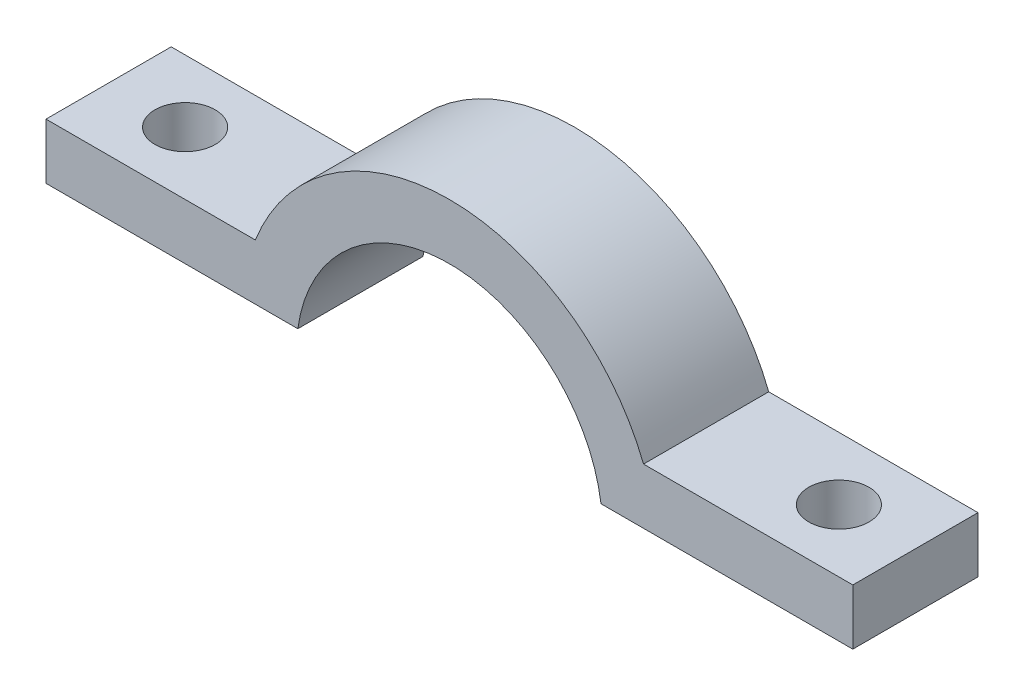
ISO-10303-21;
HEADER;
FILE_DESCRIPTION(('STEP AP214'),'2;1');
FILE_NAME('part.step','',(''),(''),'','','');
FILE_SCHEMA(('AUTOMOTIVE_DESIGN { 1 0 10303 214 1 1 1 1 }'));
ENDSEC;
DATA;
#1=APPLICATION_CONTEXT('core data for automotive mechanical design processes');
#2=APPLICATION_PROTOCOL_DEFINITION('international standard','automotive_design',2000,#1);
#3=PRODUCT_CONTEXT('',#1,'mechanical');
#4=PRODUCT('Part','Part','',(#3));
#5=PRODUCT_RELATED_PRODUCT_CATEGORY('part','',(#4));
#6=PRODUCT_DEFINITION_FORMATION('','',#4);
#7=PRODUCT_DEFINITION_CONTEXT('part definition',#1,'design');
#8=PRODUCT_DEFINITION('design','',#6,#7);
#9=PRODUCT_DEFINITION_SHAPE('','',#8);
#10=(LENGTH_UNIT() NAMED_UNIT(*) SI_UNIT(.MILLI.,.METRE.));
#11=(NAMED_UNIT(*) PLANE_ANGLE_UNIT() SI_UNIT($,.RADIAN.));
#12=(NAMED_UNIT(*) SI_UNIT($,.STERADIAN.) SOLID_ANGLE_UNIT());
#13=UNCERTAINTY_MEASURE_WITH_UNIT(LENGTH_MEASURE(1.E-05),#10,'distance_accuracy_value','');
#14=(GEOMETRIC_REPRESENTATION_CONTEXT(3) GLOBAL_UNCERTAINTY_ASSIGNED_CONTEXT((#13)) GLOBAL_UNIT_ASSIGNED_CONTEXT((#10,
#11,#12)) REPRESENTATION_CONTEXT('',''));
#15=CARTESIAN_POINT('',(0.,0.,0.));
#16=DIRECTION('',(0.,0.,1.));
#17=DIRECTION('',(1.,0.,0.));
#18=AXIS2_PLACEMENT_3D('',#15,#16,#17);
#19=CARTESIAN_POINT('',(-29.,-13.075,9.));
#20=DIRECTION('',(0.,1.,0.));
#21=DIRECTION('',(0.,0.,1.));
#22=AXIS2_PLACEMENT_3D('',#19,#20,#21);
#23=PLANE('',#22);
#24=CARTESIAN_POINT('',(-23.50000005,-13.075,4.5));
#25=DIRECTION('',(0.,1.,0.));
#26=DIRECTION('',(-1.,0.,0.));
#27=AXIS2_PLACEMENT_3D('',#24,#25,#26);
#28=CIRCLE('',#27,2.165);
#29=CARTESIAN_POINT('',(-25.66500005,-13.075,4.5));
#30=VERTEX_POINT('',#29);
#31=EDGE_CURVE('E145',#30,#30,#28,.T.);
#32=ORIENTED_EDGE('',*,*,#31,.T.);
#33=EDGE_LOOP('',(#32));
#34=FACE_BOUND('',#33,.T.);
#35=DIRECTION('',(1.,0.,0.));
#36=VECTOR('',#35,1.);
#37=CARTESIAN_POINT('',(-29.,-13.075,0.));
#38=LINE('',#37,#36);
#39=CARTESIAN_POINT('',(-29.,-13.075,0.));
#40=VERTEX_POINT('',#39);
#41=CARTESIAN_POINT('',(-10.8972473588517,-13.075,0.));
#42=VERTEX_POINT('',#41);
#43=EDGE_CURVE('E140',#40,#42,#38,.T.);
#44=ORIENTED_EDGE('',*,*,#43,.T.);
#45=DIRECTION('',(0.,0.,-1.));
#46=VECTOR('',#45,1.);
#47=CARTESIAN_POINT('',(-10.8972473588517,-13.075,9.));
#48=LINE('',#47,#46);
#49=CARTESIAN_POINT('',(-10.8972473588517,-13.075,9.));
#50=VERTEX_POINT('',#49);
#51=EDGE_CURVE('E11',#50,#42,#48,.T.);
#52=ORIENTED_EDGE('',*,*,#51,.F.);
#53=DIRECTION('',(1.,0.,0.));
#54=VECTOR('',#53,1.);
#55=CARTESIAN_POINT('',(-29.,-13.075,9.));
#56=LINE('',#55,#54);
#57=CARTESIAN_POINT('',(-29.,-13.075,9.));
#58=VERTEX_POINT('',#57);
#59=EDGE_CURVE('E163',#58,#50,#56,.T.);
#60=ORIENTED_EDGE('',*,*,#59,.F.);
#61=DIRECTION('',(0.,0.,-1.));
#62=VECTOR('',#61,1.);
#63=CARTESIAN_POINT('',(-29.,-13.075,9.));
#64=LINE('',#63,#62);
#65=EDGE_CURVE('E136',#58,#40,#64,.T.);
#66=ORIENTED_EDGE('',*,*,#65,.T.);
#67=EDGE_LOOP('',(#44,#52,#60,#66));
#68=FACE_BOUND('',#67,.T.);
#69=ADVANCED_FACE('F39',(#34,#68),#23,.F.);
#70=CARTESIAN_POINT('',(0.,-14.575,9.));
#71=DIRECTION('',(0.,0.,-1.));
#72=DIRECTION('',(-1.,0.,0.));
#73=AXIS2_PLACEMENT_3D('',#70,#71,#72);
#74=CYLINDRICAL_SURFACE('',#73,11.);
#75=CARTESIAN_POINT('',(0.,-14.575,0.));
#76=DIRECTION('',(0.,0.,-1.));
#77=DIRECTION('',(1.,0.,0.));
#78=AXIS2_PLACEMENT_3D('',#75,#76,#77);
#79=CIRCLE('',#78,11.);
#80=CARTESIAN_POINT('',(10.8972473588517,-13.075,0.));
#81=VERTEX_POINT('',#80);
#82=EDGE_CURVE('E144',#42,#81,#79,.T.);
#83=ORIENTED_EDGE('',*,*,#82,.T.);
#84=DIRECTION('',(0.,0.,-1.));
#85=VECTOR('',#84,1.);
#86=CARTESIAN_POINT('',(10.8972473588517,-13.075,9.));
#87=LINE('',#86,#85);
#88=CARTESIAN_POINT('',(10.8972473588517,-13.075,9.));
#89=VERTEX_POINT('',#88);
#90=EDGE_CURVE('E48',#89,#81,#87,.T.);
#91=ORIENTED_EDGE('',*,*,#90,.F.);
#92=CARTESIAN_POINT('',(0.,-14.575,9.));
#93=DIRECTION('',(0.,0.,-1.));
#94=DIRECTION('',(1.,0.,0.));
#95=AXIS2_PLACEMENT_3D('',#92,#93,#94);
#96=CIRCLE('',#95,11.);
#97=EDGE_CURVE('E99',#50,#89,#96,.T.);
#98=ORIENTED_EDGE('',*,*,#97,.F.);
#99=ORIENTED_EDGE('',*,*,#51,.T.);
#100=EDGE_LOOP('',(#83,#91,#98,#99));
#101=FACE_BOUND('',#100,.T.);
#102=ADVANCED_FACE('F242',(#101),#74,.F.);
#103=CARTESIAN_POINT('',(29.,-13.075,9.));
#104=DIRECTION('',(0.,1.,0.));
#105=DIRECTION('',(0.,0.,1.));
#106=AXIS2_PLACEMENT_3D('',#103,#104,#105);
#107=PLANE('',#106);
#108=CARTESIAN_POINT('',(23.50000005,-13.075,4.5));
#109=DIRECTION('',(0.,1.,0.));
#110=DIRECTION('',(-1.,0.,0.));
#111=AXIS2_PLACEMENT_3D('',#108,#109,#110);
#112=CIRCLE('',#111,2.165);
#113=CARTESIAN_POINT('',(21.33500005,-13.075,4.5));
#114=VERTEX_POINT('',#113);
#115=EDGE_CURVE('E211',#114,#114,#112,.T.);
#116=ORIENTED_EDGE('',*,*,#115,.T.);
#117=EDGE_LOOP('',(#116));
#118=FACE_BOUND('',#117,.T.);
#119=DIRECTION('',(1.,0.,0.));
#120=VECTOR('',#119,1.);
#121=CARTESIAN_POINT('',(29.,-13.075,0.));
#122=LINE('',#121,#120);
#123=CARTESIAN_POINT('',(29.,-13.075,0.));
#124=VERTEX_POINT('',#123);
#125=EDGE_CURVE('E148',#81,#124,#122,.T.);
#126=ORIENTED_EDGE('',*,*,#125,.T.);
#127=DIRECTION('',(0.,0.,-1.));
#128=VECTOR('',#127,1.);
#129=CARTESIAN_POINT('',(29.,-13.075,9.));
#130=LINE('',#129,#128);
#131=CARTESIAN_POINT('',(29.,-13.075,9.));
#132=VERTEX_POINT('',#131);
#133=EDGE_CURVE('E174',#132,#124,#130,.T.);
#134=ORIENTED_EDGE('',*,*,#133,.F.);
#135=DIRECTION('',(1.,0.,0.));
#136=VECTOR('',#135,1.);
#137=CARTESIAN_POINT('',(29.,-13.075,9.));
#138=LINE('',#137,#136);
#139=EDGE_CURVE('E184',#89,#132,#138,.T.);
#140=ORIENTED_EDGE('',*,*,#139,.F.);
#141=ORIENTED_EDGE('',*,*,#90,.T.);
#142=EDGE_LOOP('',(#126,#134,#140,#141));
#143=FACE_BOUND('',#142,.T.);
#144=ADVANCED_FACE('F182',(#118,#143),#107,.F.);
#145=CARTESIAN_POINT('',(29.,-13.075,9.));
#146=DIRECTION('',(-1.,0.,0.));
#147=DIRECTION('',(0.,0.,1.));
#148=AXIS2_PLACEMENT_3D('',#145,#146,#147);
#149=PLANE('',#148);
#150=DIRECTION('',(0.,1.,0.));
#151=VECTOR('',#150,1.);
#152=CARTESIAN_POINT('',(29.,-13.075,0.));
#153=LINE('',#152,#151);
#154=CARTESIAN_POINT('',(29.,-9.07500000000001,0.));
#155=VERTEX_POINT('',#154);
#156=EDGE_CURVE('E151',#124,#155,#153,.T.);
#157=ORIENTED_EDGE('',*,*,#156,.T.);
#158=DIRECTION('',(0.,0.,-1.));
#159=VECTOR('',#158,1.);
#160=CARTESIAN_POINT('',(29.,-9.07500000000001,9.));
#161=LINE('',#160,#159);
#162=CARTESIAN_POINT('',(29.,-9.07500000000001,9.));
#163=VERTEX_POINT('',#162);
#164=EDGE_CURVE('E170',#163,#155,#161,.T.);
#165=ORIENTED_EDGE('',*,*,#164,.F.);
#166=DIRECTION('',(0.,1.,0.));
#167=VECTOR('',#166,1.);
#168=CARTESIAN_POINT('',(29.,-13.075,9.));
#169=LINE('',#168,#167);
#170=EDGE_CURVE('E197',#132,#163,#169,.T.);
#171=ORIENTED_EDGE('',*,*,#170,.F.);
#172=ORIENTED_EDGE('',*,*,#133,.T.);
#173=EDGE_LOOP('',(#157,#165,#171,#172));
#174=FACE_BOUND('',#173,.T.);
#175=ADVANCED_FACE('F192',(#174),#149,.F.);
#176=CARTESIAN_POINT('',(13.9552857369529,-9.07500000000001,9.));
#177=DIRECTION('',(0.,-1.,0.));
#178=DIRECTION('',(1.,0.,0.));
#179=AXIS2_PLACEMENT_3D('',#176,#177,#178);
#180=PLANE('',#179);
#181=CARTESIAN_POINT('',(23.50000005,-9.07500000000002,4.5));
#182=DIRECTION('',(0.,1.,0.));
#183=DIRECTION('',(-1.,0.,0.));
#184=AXIS2_PLACEMENT_3D('',#181,#182,#183);
#185=CIRCLE('',#184,2.165);
#186=CARTESIAN_POINT('',(21.33500005,-9.07500000000002,4.5));
#187=VERTEX_POINT('',#186);
#188=EDGE_CURVE('E207',#187,#187,#185,.T.);
#189=ORIENTED_EDGE('',*,*,#188,.F.);
#190=EDGE_LOOP('',(#189));
#191=FACE_BOUND('',#190,.T.);
#192=DIRECTION('',(-1.,0.,0.));
#193=VECTOR('',#192,1.);
#194=CARTESIAN_POINT('',(13.9552857369529,-9.07500000000001,0.));
#195=LINE('',#194,#193);
#196=CARTESIAN_POINT('',(13.9552857369529,-9.07500000000001,0.));
#197=VERTEX_POINT('',#196);
#198=EDGE_CURVE('E154',#155,#197,#195,.T.);
#199=ORIENTED_EDGE('',*,*,#198,.T.);
#200=DIRECTION('',(0.,0.,-1.));
#201=VECTOR('',#200,1.);
#202=CARTESIAN_POINT('',(13.9552857369529,-9.07500000000001,9.));
#203=LINE('',#202,#201);
#204=CARTESIAN_POINT('',(13.9552857369529,-9.07500000000001,9.));
#205=VERTEX_POINT('',#204);
#206=EDGE_CURVE('E129',#205,#197,#203,.T.);
#207=ORIENTED_EDGE('',*,*,#206,.F.);
#208=DIRECTION('',(-1.,0.,0.));
#209=VECTOR('',#208,1.);
#210=CARTESIAN_POINT('',(13.9552857369529,-9.07500000000001,9.));
#211=LINE('',#210,#209);
#212=EDGE_CURVE('E118',#163,#205,#211,.T.);
#213=ORIENTED_EDGE('',*,*,#212,.F.);
#214=ORIENTED_EDGE('',*,*,#164,.T.);
#215=EDGE_LOOP('',(#199,#207,#213,#214));
#216=FACE_BOUND('',#215,.T.);
#217=ADVANCED_FACE('F195',(#191,#216),#180,.F.);
#218=CARTESIAN_POINT('',(0.,-14.575,9.));
#219=DIRECTION('',(0.,0.,-1.));
#220=DIRECTION('',(-1.,0.,0.));
#221=AXIS2_PLACEMENT_3D('',#218,#219,#220);
#222=CYLINDRICAL_SURFACE('',#221,15.);
#223=CARTESIAN_POINT('',(0.,-14.575,0.));
#224=DIRECTION('',(0.,0.,1.));
#225=DIRECTION('',(1.,0.,0.));
#226=AXIS2_PLACEMENT_3D('',#223,#224,#225);
#227=CIRCLE('',#226,15.);
#228=CARTESIAN_POINT('',(-13.9552857369529,-9.07500000000001,0.));
#229=VERTEX_POINT('',#228);
#230=EDGE_CURVE('E127',#197,#229,#227,.T.);
#231=ORIENTED_EDGE('',*,*,#230,.T.);
#232=DIRECTION('',(0.,0.,-1.));
#233=VECTOR('',#232,1.);
#234=CARTESIAN_POINT('',(-13.9552857369529,-9.07500000000001,9.));
#235=LINE('',#234,#233);
#236=CARTESIAN_POINT('',(-13.9552857369529,-9.07500000000001,9.));
#237=VERTEX_POINT('',#236);
#238=EDGE_CURVE('E124',#237,#229,#235,.T.);
#239=ORIENTED_EDGE('',*,*,#238,.F.);
#240=CARTESIAN_POINT('',(0.,-14.575,9.));
#241=DIRECTION('',(0.,0.,1.));
#242=DIRECTION('',(1.,0.,0.));
#243=AXIS2_PLACEMENT_3D('',#240,#241,#242);
#244=CIRCLE('',#243,15.);
#245=EDGE_CURVE('E112',#205,#237,#244,.T.);
#246=ORIENTED_EDGE('',*,*,#245,.F.);
#247=ORIENTED_EDGE('',*,*,#206,.T.);
#248=EDGE_LOOP('',(#231,#239,#246,#247));
#249=FACE_BOUND('',#248,.T.);
#250=ADVANCED_FACE('F125',(#249),#222,.T.);
#251=CARTESIAN_POINT('',(-29.,-9.07500000000001,9.));
#252=DIRECTION('',(0.,-1.,0.));
#253=DIRECTION('',(1.,0.,0.));
#254=AXIS2_PLACEMENT_3D('',#251,#252,#253);
#255=PLANE('',#254);
#256=CARTESIAN_POINT('',(-23.50000005,-9.07500000000001,4.5));
#257=DIRECTION('',(0.,1.,0.));
#258=DIRECTION('',(-1.,0.,0.));
#259=AXIS2_PLACEMENT_3D('',#256,#257,#258);
#260=CIRCLE('',#259,2.165);
#261=CARTESIAN_POINT('',(-25.66500005,-9.07500000000001,4.5));
#262=VERTEX_POINT('',#261);
#263=EDGE_CURVE('E215',#262,#262,#260,.T.);
#264=ORIENTED_EDGE('',*,*,#263,.F.);
#265=EDGE_LOOP('',(#264));
#266=FACE_BOUND('',#265,.T.);
#267=DIRECTION('',(-1.,0.,0.));
#268=VECTOR('',#267,1.);
#269=CARTESIAN_POINT('',(-29.,-9.07500000000001,0.));
#270=LINE('',#269,#268);
#271=CARTESIAN_POINT('',(-29.,-9.07500000000001,0.));
#272=VERTEX_POINT('',#271);
#273=EDGE_CURVE('E85',#229,#272,#270,.T.);
#274=ORIENTED_EDGE('',*,*,#273,.T.);
#275=DIRECTION('',(0.,0.,-1.));
#276=VECTOR('',#275,1.);
#277=CARTESIAN_POINT('',(-29.,-9.07500000000001,9.));
#278=LINE('',#277,#276);
#279=CARTESIAN_POINT('',(-29.,-9.07500000000001,9.));
#280=VERTEX_POINT('',#279);
#281=EDGE_CURVE('E130',#280,#272,#278,.T.);
#282=ORIENTED_EDGE('',*,*,#281,.F.);
#283=DIRECTION('',(-1.,0.,0.));
#284=VECTOR('',#283,1.);
#285=CARTESIAN_POINT('',(-29.,-9.07500000000001,9.));
#286=LINE('',#285,#284);
#287=EDGE_CURVE('E116',#237,#280,#286,.T.);
#288=ORIENTED_EDGE('',*,*,#287,.F.);
#289=ORIENTED_EDGE('',*,*,#238,.T.);
#290=EDGE_LOOP('',(#274,#282,#288,#289));
#291=FACE_BOUND('',#290,.T.);
#292=ADVANCED_FACE('F132',(#266,#291),#255,.F.);
#293=CARTESIAN_POINT('',(-29.,-13.075,9.));
#294=DIRECTION('',(1.,0.,0.));
#295=DIRECTION('',(0.,0.,-1.));
#296=AXIS2_PLACEMENT_3D('',#293,#294,#295);
#297=PLANE('',#296);
#298=DIRECTION('',(0.,-1.,0.));
#299=VECTOR('',#298,1.);
#300=CARTESIAN_POINT('',(-29.,-13.075,0.));
#301=LINE('',#300,#299);
#302=EDGE_CURVE('E91',#272,#40,#301,.T.);
#303=ORIENTED_EDGE('',*,*,#302,.T.);
#304=ORIENTED_EDGE('',*,*,#65,.F.);
#305=DIRECTION('',(0.,-1.,0.));
#306=VECTOR('',#305,1.);
#307=CARTESIAN_POINT('',(-29.,-13.075,9.));
#308=LINE('',#307,#306);
#309=EDGE_CURVE('E56',#280,#58,#308,.T.);
#310=ORIENTED_EDGE('',*,*,#309,.F.);
#311=ORIENTED_EDGE('',*,*,#281,.T.);
#312=EDGE_LOOP('',(#303,#304,#310,#311));
#313=FACE_BOUND('',#312,.T.);
#314=ADVANCED_FACE('F233',(#313),#297,.F.);
#315=CARTESIAN_POINT('',(0.,-14.575,9.));
#316=DIRECTION('',(0.,0.,1.));
#317=DIRECTION('',(1.,0.,0.));
#318=AXIS2_PLACEMENT_3D('',#315,#316,#317);
#319=PLANE('',#318);
#320=ORIENTED_EDGE('',*,*,#59,.T.);
#321=ORIENTED_EDGE('',*,*,#97,.T.);
#322=ORIENTED_EDGE('',*,*,#139,.T.);
#323=ORIENTED_EDGE('',*,*,#170,.T.);
#324=ORIENTED_EDGE('',*,*,#212,.T.);
#325=ORIENTED_EDGE('',*,*,#245,.T.);
#326=ORIENTED_EDGE('',*,*,#287,.T.);
#327=ORIENTED_EDGE('',*,*,#309,.T.);
#328=EDGE_LOOP('',(#320,#321,#322,#323,#324,#325,#326,#327));
#329=FACE_BOUND('',#328,.T.);
#330=ADVANCED_FACE('F114',(#329),#319,.T.);
#331=CARTESIAN_POINT('',(0.,-14.575,0.));
#332=DIRECTION('',(0.,0.,1.));
#333=DIRECTION('',(1.,0.,0.));
#334=AXIS2_PLACEMENT_3D('',#331,#332,#333);
#335=PLANE('',#334);
#336=ORIENTED_EDGE('',*,*,#43,.F.);
#337=ORIENTED_EDGE('',*,*,#302,.F.);
#338=ORIENTED_EDGE('',*,*,#273,.F.);
#339=ORIENTED_EDGE('',*,*,#230,.F.);
#340=ORIENTED_EDGE('',*,*,#198,.F.);
#341=ORIENTED_EDGE('',*,*,#156,.F.);
#342=ORIENTED_EDGE('',*,*,#125,.F.);
#343=ORIENTED_EDGE('',*,*,#82,.F.);
#344=EDGE_LOOP('',(#336,#337,#338,#339,#340,#341,#342,#343));
#345=FACE_BOUND('',#344,.T.);
#346=ADVANCED_FACE('F188',(#345),#335,.F.);
#347=CARTESIAN_POINT('',(-23.50000005,-13.075,4.5));
#348=DIRECTION('',(0.,1.,0.));
#349=DIRECTION('',(-1.,0.,0.));
#350=AXIS2_PLACEMENT_3D('',#347,#348,#349);
#351=CYLINDRICAL_SURFACE('',#350,2.165);
#352=ORIENTED_EDGE('',*,*,#31,.F.);
#353=EDGE_LOOP('',(#352));
#354=FACE_BOUND('',#353,.T.);
#355=ORIENTED_EDGE('',*,*,#263,.T.);
#356=EDGE_LOOP('',(#355));
#357=FACE_BOUND('',#356,.T.);
#358=ADVANCED_FACE('F225',(#354,#357),#351,.F.);
#359=CARTESIAN_POINT('',(23.50000005,-13.075,4.5));
#360=DIRECTION('',(0.,1.,0.));
#361=DIRECTION('',(-1.,0.,0.));
#362=AXIS2_PLACEMENT_3D('',#359,#360,#361);
#363=CYLINDRICAL_SURFACE('',#362,2.165);
#364=ORIENTED_EDGE('',*,*,#115,.F.);
#365=EDGE_LOOP('',(#364));
#366=FACE_BOUND('',#365,.T.);
#367=ORIENTED_EDGE('',*,*,#188,.T.);
#368=EDGE_LOOP('',(#367));
#369=FACE_BOUND('',#368,.T.);
#370=ADVANCED_FACE('F228',(#366,#369),#363,.F.);
#371=CLOSED_SHELL('',(#69,#102,#144,#175,#217,#250,#292,#314,#330,#346,#358,#370));
#372=MANIFOLD_SOLID_BREP('B2',#371);
#373=ADVANCED_BREP_SHAPE_REPRESENTATION('',(#18,#372),#14);
#374=SHAPE_DEFINITION_REPRESENTATION(#9,#373);
ENDSEC;
END-ISO-10303-21;
